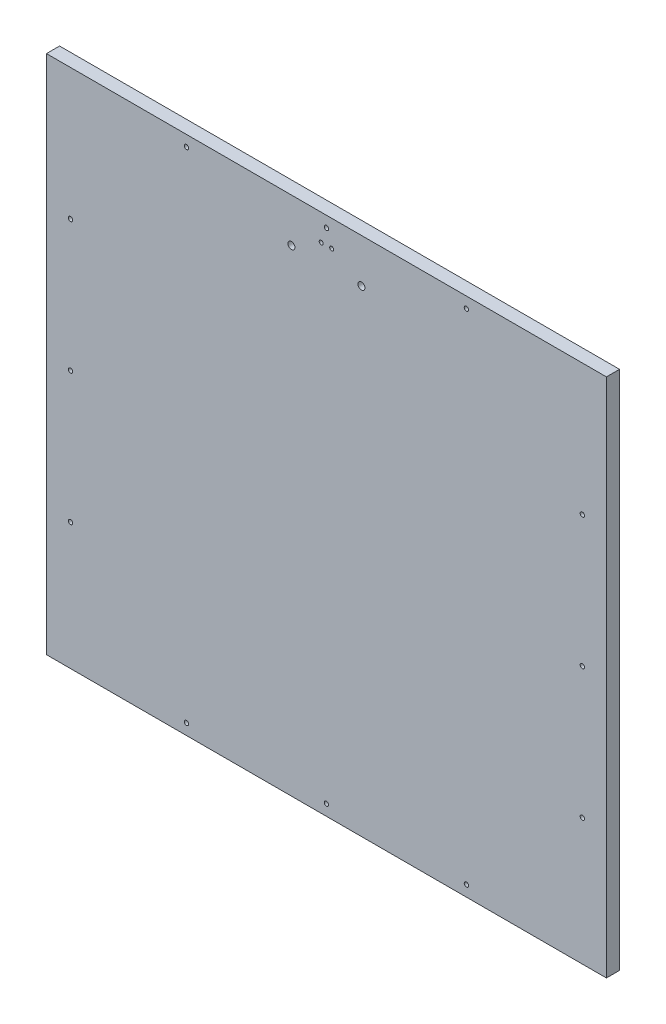
ISO-10303-21;
HEADER;
FILE_DESCRIPTION(('STEP AP214'),'2;1');
FILE_NAME('part.step','',(''),(''),'','','');
FILE_SCHEMA(('AUTOMOTIVE_DESIGN { 1 0 10303 214 1 1 1 1 }'));
ENDSEC;
DATA;
#1=APPLICATION_CONTEXT('core data for automotive mechanical design processes');
#2=APPLICATION_PROTOCOL_DEFINITION('international standard','automotive_design',2000,#1);
#3=PRODUCT_CONTEXT('',#1,'mechanical');
#4=PRODUCT('Part','Part','',(#3));
#5=PRODUCT_RELATED_PRODUCT_CATEGORY('part','',(#4));
#6=PRODUCT_DEFINITION_FORMATION('','',#4);
#7=PRODUCT_DEFINITION_CONTEXT('part definition',#1,'design');
#8=PRODUCT_DEFINITION('design','',#6,#7);
#9=PRODUCT_DEFINITION_SHAPE('','',#8);
#10=(LENGTH_UNIT() NAMED_UNIT(*) SI_UNIT(.MILLI.,.METRE.));
#11=(NAMED_UNIT(*) PLANE_ANGLE_UNIT() SI_UNIT($,.RADIAN.));
#12=(NAMED_UNIT(*) SI_UNIT($,.STERADIAN.) SOLID_ANGLE_UNIT());
#13=UNCERTAINTY_MEASURE_WITH_UNIT(LENGTH_MEASURE(1.E-05),#10,'distance_accuracy_value','');
#14=(GEOMETRIC_REPRESENTATION_CONTEXT(3) GLOBAL_UNCERTAINTY_ASSIGNED_CONTEXT((#13)) GLOBAL_UNIT_ASSIGNED_CONTEXT((#10,
#11,#12)) REPRESENTATION_CONTEXT('',''));
#15=CARTESIAN_POINT('',(0.,0.,0.));
#16=DIRECTION('',(0.,0.,1.));
#17=DIRECTION('',(1.,0.,0.));
#18=AXIS2_PLACEMENT_3D('',#15,#16,#17);
#19=CARTESIAN_POINT('',(320.,297.5,15.));
#20=DIRECTION('',(-1.,0.,0.));
#21=DIRECTION('',(0.,-1.,0.));
#22=AXIS2_PLACEMENT_3D('',#19,#20,#21);
#23=PLANE('',#22);
#24=DIRECTION('',(0.,1.,0.));
#25=VECTOR('',#24,1.);
#26=CARTESIAN_POINT('',(320.,297.5,0.));
#27=LINE('',#26,#25);
#28=CARTESIAN_POINT('',(320.,-297.5,0.));
#29=VERTEX_POINT('',#28);
#30=CARTESIAN_POINT('',(320.,297.5,0.));
#31=VERTEX_POINT('',#30);
#32=EDGE_CURVE('E102',#29,#31,#27,.T.);
#33=ORIENTED_EDGE('',*,*,#32,.T.);
#34=DIRECTION('',(0.,0.,-1.));
#35=VECTOR('',#34,1.);
#36=CARTESIAN_POINT('',(320.,297.5,15.));
#37=LINE('',#36,#35);
#38=CARTESIAN_POINT('',(320.,297.5,15.));
#39=VERTEX_POINT('',#38);
#40=EDGE_CURVE('E11',#39,#31,#37,.T.);
#41=ORIENTED_EDGE('',*,*,#40,.F.);
#42=DIRECTION('',(0.,1.,0.));
#43=VECTOR('',#42,1.);
#44=CARTESIAN_POINT('',(320.,297.5,15.));
#45=LINE('',#44,#43);
#46=CARTESIAN_POINT('',(320.,-297.5,15.));
#47=VERTEX_POINT('',#46);
#48=EDGE_CURVE('E90',#47,#39,#45,.T.);
#49=ORIENTED_EDGE('',*,*,#48,.F.);
#50=DIRECTION('',(0.,0.,-1.));
#51=VECTOR('',#50,1.);
#52=CARTESIAN_POINT('',(320.,-297.5,15.));
#53=LINE('',#52,#51);
#54=EDGE_CURVE('E98',#47,#29,#53,.T.);
#55=ORIENTED_EDGE('',*,*,#54,.T.);
#56=EDGE_LOOP('',(#33,#41,#49,#55));
#57=FACE_BOUND('',#56,.T.);
#58=ADVANCED_FACE('F39',(#57),#23,.F.);
#59=CARTESIAN_POINT('',(-320.,297.5,15.));
#60=DIRECTION('',(0.,-1.,0.));
#61=DIRECTION('',(0.,0.,-1.));
#62=AXIS2_PLACEMENT_3D('',#59,#60,#61);
#63=PLANE('',#62);
#64=DIRECTION('',(-1.,0.,0.));
#65=VECTOR('',#64,1.);
#66=CARTESIAN_POINT('',(-320.,297.5,0.));
#67=LINE('',#66,#65);
#68=CARTESIAN_POINT('',(-320.,297.5,0.));
#69=VERTEX_POINT('',#68);
#70=EDGE_CURVE('E94',#31,#69,#67,.T.);
#71=ORIENTED_EDGE('',*,*,#70,.T.);
#72=DIRECTION('',(0.,0.,-1.));
#73=VECTOR('',#72,1.);
#74=CARTESIAN_POINT('',(-320.,297.5,15.));
#75=LINE('',#74,#73);
#76=CARTESIAN_POINT('',(-320.,297.5,15.));
#77=VERTEX_POINT('',#76);
#78=EDGE_CURVE('E47',#77,#69,#75,.T.);
#79=ORIENTED_EDGE('',*,*,#78,.F.);
#80=DIRECTION('',(-1.,0.,0.));
#81=VECTOR('',#80,1.);
#82=CARTESIAN_POINT('',(-320.,297.5,15.));
#83=LINE('',#82,#81);
#84=EDGE_CURVE('E85',#39,#77,#83,.T.);
#85=ORIENTED_EDGE('',*,*,#84,.F.);
#86=ORIENTED_EDGE('',*,*,#40,.T.);
#87=EDGE_LOOP('',(#71,#79,#85,#86));
#88=FACE_BOUND('',#87,.T.);
#89=ADVANCED_FACE('F93',(#88),#63,.F.);
#90=CARTESIAN_POINT('',(-320.,297.5,15.));
#91=DIRECTION('',(1.,0.,0.));
#92=DIRECTION('',(0.,0.,-1.));
#93=AXIS2_PLACEMENT_3D('',#90,#91,#92);
#94=PLANE('',#93);
#95=DIRECTION('',(0.,-1.,0.));
#96=VECTOR('',#95,1.);
#97=CARTESIAN_POINT('',(-320.,297.5,0.));
#98=LINE('',#97,#96);
#99=CARTESIAN_POINT('',(-320.,-297.5,0.));
#100=VERTEX_POINT('',#99);
#101=EDGE_CURVE('E72',#69,#100,#98,.T.);
#102=ORIENTED_EDGE('',*,*,#101,.T.);
#103=DIRECTION('',(0.,0.,-1.));
#104=VECTOR('',#103,1.);
#105=CARTESIAN_POINT('',(-320.,-297.5,15.));
#106=LINE('',#105,#104);
#107=CARTESIAN_POINT('',(-320.,-297.5,15.));
#108=VERTEX_POINT('',#107);
#109=EDGE_CURVE('E95',#108,#100,#106,.T.);
#110=ORIENTED_EDGE('',*,*,#109,.F.);
#111=DIRECTION('',(0.,-1.,0.));
#112=VECTOR('',#111,1.);
#113=CARTESIAN_POINT('',(-320.,297.5,15.));
#114=LINE('',#113,#112);
#115=EDGE_CURVE('E88',#77,#108,#114,.T.);
#116=ORIENTED_EDGE('',*,*,#115,.F.);
#117=ORIENTED_EDGE('',*,*,#78,.T.);
#118=EDGE_LOOP('',(#102,#110,#116,#117));
#119=FACE_BOUND('',#118,.T.);
#120=ADVANCED_FACE('F96',(#119),#94,.F.);
#121=CARTESIAN_POINT('',(-320.,-297.5,15.));
#122=DIRECTION('',(0.,1.,0.));
#123=DIRECTION('',(0.,0.,1.));
#124=AXIS2_PLACEMENT_3D('',#121,#122,#123);
#125=PLANE('',#124);
#126=DIRECTION('',(1.,0.,0.));
#127=VECTOR('',#126,1.);
#128=CARTESIAN_POINT('',(-320.,-297.5,0.));
#129=LINE('',#128,#127);
#130=EDGE_CURVE('E78',#100,#29,#129,.T.);
#131=ORIENTED_EDGE('',*,*,#130,.T.);
#132=ORIENTED_EDGE('',*,*,#54,.F.);
#133=DIRECTION('',(1.,0.,0.));
#134=VECTOR('',#133,1.);
#135=CARTESIAN_POINT('',(-320.,-297.5,15.));
#136=LINE('',#135,#134);
#137=EDGE_CURVE('E55',#108,#47,#136,.T.);
#138=ORIENTED_EDGE('',*,*,#137,.F.);
#139=ORIENTED_EDGE('',*,*,#109,.T.);
#140=EDGE_LOOP('',(#131,#132,#138,#139));
#141=FACE_BOUND('',#140,.T.);
#142=ADVANCED_FACE('F110',(#141),#125,.F.);
#143=CARTESIAN_POINT('',(0.,0.,15.));
#144=DIRECTION('',(0.,0.,1.));
#145=DIRECTION('',(1.,0.,0.));
#146=AXIS2_PLACEMENT_3D('',#143,#144,#145);
#147=PLANE('',#146);
#148=CARTESIAN_POINT('',(-6.,267.5,15.));
#149=DIRECTION('',(0.,0.,-1.));
#150=DIRECTION('',(-1.,0.,0.));
#151=AXIS2_PLACEMENT_3D('',#148,#149,#150);
#152=CIRCLE('',#151,2.25);
#153=CARTESIAN_POINT('',(-8.25,267.5,15.));
#154=VERTEX_POINT('',#153);
#155=EDGE_CURVE('E206',#154,#154,#152,.T.);
#156=ORIENTED_EDGE('',*,*,#155,.T.);
#157=EDGE_LOOP('',(#156));
#158=FACE_BOUND('',#157,.T.);
#159=CARTESIAN_POINT('',(6.,267.5,15.));
#160=DIRECTION('',(0.,0.,1.));
#161=DIRECTION('',(1.,0.,0.));
#162=AXIS2_PLACEMENT_3D('',#159,#160,#161);
#163=CIRCLE('',#162,2.25);
#164=CARTESIAN_POINT('',(8.25,267.5,15.));
#165=VERTEX_POINT('',#164);
#166=EDGE_CURVE('E200',#165,#165,#163,.T.);
#167=ORIENTED_EDGE('',*,*,#166,.F.);
#168=EDGE_LOOP('',(#167));
#169=FACE_BOUND('',#168,.T.);
#170=CARTESIAN_POINT('',(40.0000000000001,247.5,15.));
#171=DIRECTION('',(0.,0.,-1.));
#172=DIRECTION('',(-1.,0.,0.));
#173=AXIS2_PLACEMENT_3D('',#170,#171,#172);
#174=CIRCLE('',#173,4.);
#175=CARTESIAN_POINT('',(36.0000000000001,247.5,15.));
#176=VERTEX_POINT('',#175);
#177=EDGE_CURVE('E174',#176,#176,#174,.T.);
#178=ORIENTED_EDGE('',*,*,#177,.T.);
#179=EDGE_LOOP('',(#178));
#180=FACE_BOUND('',#179,.T.);
#181=CARTESIAN_POINT('',(-39.9999999999999,247.5,15.));
#182=DIRECTION('',(0.,0.,-1.));
#183=DIRECTION('',(-1.,0.,0.));
#184=AXIS2_PLACEMENT_3D('',#181,#182,#183);
#185=CIRCLE('',#184,4.);
#186=CARTESIAN_POINT('',(-43.9999999999999,247.5,15.));
#187=VERTEX_POINT('',#186);
#188=EDGE_CURVE('E188',#187,#187,#185,.T.);
#189=ORIENTED_EDGE('',*,*,#188,.T.);
#190=EDGE_LOOP('',(#189));
#191=FACE_BOUND('',#190,.T.);
#192=CARTESIAN_POINT('',(292.5,147.5,15.));
#193=DIRECTION('',(0.,0.,-1.));
#194=DIRECTION('',(-1.,0.,0.));
#195=AXIS2_PLACEMENT_3D('',#192,#193,#194);
#196=CIRCLE('',#195,2.50000000000002);
#197=CARTESIAN_POINT('',(290.,147.5,15.));
#198=VERTEX_POINT('',#197);
#199=EDGE_CURVE('E183',#198,#198,#196,.T.);
#200=ORIENTED_EDGE('',*,*,#199,.T.);
#201=EDGE_LOOP('',(#200));
#202=FACE_BOUND('',#201,.T.);
#203=CARTESIAN_POINT('',(292.5,-2.50000000000006,15.));
#204=DIRECTION('',(0.,0.,-1.));
#205=DIRECTION('',(-1.,0.,0.));
#206=AXIS2_PLACEMENT_3D('',#203,#204,#205);
#207=CIRCLE('',#206,2.50000000000002);
#208=CARTESIAN_POINT('',(290.,-2.50000000000006,15.));
#209=VERTEX_POINT('',#208);
#210=EDGE_CURVE('E177',#209,#209,#207,.T.);
#211=ORIENTED_EDGE('',*,*,#210,.T.);
#212=EDGE_LOOP('',(#211));
#213=FACE_BOUND('',#212,.T.);
#214=CARTESIAN_POINT('',(292.5,-152.5,15.));
#215=DIRECTION('',(0.,0.,-1.));
#216=DIRECTION('',(-1.,0.,0.));
#217=AXIS2_PLACEMENT_3D('',#214,#215,#216);
#218=CIRCLE('',#217,2.50000000000002);
#219=CARTESIAN_POINT('',(290.,-152.5,15.));
#220=VERTEX_POINT('',#219);
#221=EDGE_CURVE('E170',#220,#220,#218,.T.);
#222=ORIENTED_EDGE('',*,*,#221,.T.);
#223=EDGE_LOOP('',(#222));
#224=FACE_BOUND('',#223,.T.);
#225=CARTESIAN_POINT('',(-160.,-285.,15.));
#226=DIRECTION('',(0.,0.,-1.));
#227=DIRECTION('',(1.,0.,0.));
#228=AXIS2_PLACEMENT_3D('',#225,#226,#227);
#229=CIRCLE('',#228,2.5);
#230=CARTESIAN_POINT('',(-157.5,-285.,15.));
#231=VERTEX_POINT('',#230);
#232=EDGE_CURVE('E165',#231,#231,#229,.T.);
#233=ORIENTED_EDGE('',*,*,#232,.T.);
#234=EDGE_LOOP('',(#233));
#235=FACE_BOUND('',#234,.T.);
#236=CARTESIAN_POINT('',(0.,-285.,15.));
#237=DIRECTION('',(0.,0.,-1.));
#238=DIRECTION('',(1.,0.,0.));
#239=AXIS2_PLACEMENT_3D('',#236,#237,#238);
#240=CIRCLE('',#239,2.5);
#241=CARTESIAN_POINT('',(2.5,-285.,15.));
#242=VERTEX_POINT('',#241);
#243=EDGE_CURVE('E159',#242,#242,#240,.T.);
#244=ORIENTED_EDGE('',*,*,#243,.T.);
#245=EDGE_LOOP('',(#244));
#246=FACE_BOUND('',#245,.T.);
#247=CARTESIAN_POINT('',(160.,-285.,15.));
#248=DIRECTION('',(0.,0.,-1.));
#249=DIRECTION('',(1.,0.,0.));
#250=AXIS2_PLACEMENT_3D('',#247,#248,#249);
#251=CIRCLE('',#250,2.5);
#252=CARTESIAN_POINT('',(162.5,-285.,15.));
#253=VERTEX_POINT('',#252);
#254=EDGE_CURVE('E152',#253,#253,#251,.T.);
#255=ORIENTED_EDGE('',*,*,#254,.T.);
#256=EDGE_LOOP('',(#255));
#257=FACE_BOUND('',#256,.T.);
#258=CARTESIAN_POINT('',(-292.5,147.5,15.));
#259=DIRECTION('',(0.,0.,1.));
#260=DIRECTION('',(1.,0.,0.));
#261=AXIS2_PLACEMENT_3D('',#258,#259,#260);
#262=CIRCLE('',#261,2.50000000000002);
#263=CARTESIAN_POINT('',(-290.,147.5,15.));
#264=VERTEX_POINT('',#263);
#265=EDGE_CURVE('E147',#264,#264,#262,.T.);
#266=ORIENTED_EDGE('',*,*,#265,.F.);
#267=EDGE_LOOP('',(#266));
#268=FACE_BOUND('',#267,.T.);
#269=CARTESIAN_POINT('',(-292.5,-2.50000000000006,15.));
#270=DIRECTION('',(0.,0.,1.));
#271=DIRECTION('',(1.,0.,0.));
#272=AXIS2_PLACEMENT_3D('',#269,#270,#271);
#273=CIRCLE('',#272,2.50000000000002);
#274=CARTESIAN_POINT('',(-290.,-2.50000000000006,15.));
#275=VERTEX_POINT('',#274);
#276=EDGE_CURVE('E144',#275,#275,#273,.T.);
#277=ORIENTED_EDGE('',*,*,#276,.F.);
#278=EDGE_LOOP('',(#277));
#279=FACE_BOUND('',#278,.T.);
#280=CARTESIAN_POINT('',(-292.5,-152.5,15.));
#281=DIRECTION('',(0.,0.,1.));
#282=DIRECTION('',(1.,0.,0.));
#283=AXIS2_PLACEMENT_3D('',#280,#281,#282);
#284=CIRCLE('',#283,2.50000000000002);
#285=CARTESIAN_POINT('',(-290.,-152.5,15.));
#286=VERTEX_POINT('',#285);
#287=EDGE_CURVE('E137',#286,#286,#284,.T.);
#288=ORIENTED_EDGE('',*,*,#287,.F.);
#289=EDGE_LOOP('',(#288));
#290=FACE_BOUND('',#289,.T.);
#291=CARTESIAN_POINT('',(-160.,285.,15.));
#292=DIRECTION('',(0.,0.,1.));
#293=DIRECTION('',(1.,0.,0.));
#294=AXIS2_PLACEMENT_3D('',#291,#292,#293);
#295=CIRCLE('',#294,2.5);
#296=CARTESIAN_POINT('',(-157.5,285.,15.));
#297=VERTEX_POINT('',#296);
#298=EDGE_CURVE('E129',#297,#297,#295,.T.);
#299=ORIENTED_EDGE('',*,*,#298,.F.);
#300=EDGE_LOOP('',(#299));
#301=FACE_BOUND('',#300,.T.);
#302=CARTESIAN_POINT('',(0.,285.,15.));
#303=DIRECTION('',(0.,0.,1.));
#304=DIRECTION('',(1.,0.,0.));
#305=AXIS2_PLACEMENT_3D('',#302,#303,#304);
#306=CIRCLE('',#305,2.5);
#307=CARTESIAN_POINT('',(2.5,285.,15.));
#308=VERTEX_POINT('',#307);
#309=EDGE_CURVE('E126',#308,#308,#306,.T.);
#310=ORIENTED_EDGE('',*,*,#309,.F.);
#311=EDGE_LOOP('',(#310));
#312=FACE_BOUND('',#311,.T.);
#313=CARTESIAN_POINT('',(160.,285.,15.));
#314=DIRECTION('',(0.,0.,1.));
#315=DIRECTION('',(1.,0.,0.));
#316=AXIS2_PLACEMENT_3D('',#313,#314,#315);
#317=CIRCLE('',#316,2.5);
#318=CARTESIAN_POINT('',(162.5,285.,15.));
#319=VERTEX_POINT('',#318);
#320=EDGE_CURVE('E119',#319,#319,#317,.T.);
#321=ORIENTED_EDGE('',*,*,#320,.F.);
#322=EDGE_LOOP('',(#321));
#323=FACE_BOUND('',#322,.T.);
#324=ORIENTED_EDGE('',*,*,#48,.T.);
#325=ORIENTED_EDGE('',*,*,#84,.T.);
#326=ORIENTED_EDGE('',*,*,#115,.T.);
#327=ORIENTED_EDGE('',*,*,#137,.T.);
#328=EDGE_LOOP('',(#324,#325,#326,#327));
#329=FACE_BOUND('',#328,.T.);
#330=ADVANCED_FACE('F86',(#158,#169,#180,#191,#202,#213,#224,#235,#246,#257,#268,#279,#290,#301,
#312,#323,#329),#147,.T.);
#331=CARTESIAN_POINT('',(0.,0.,0.));
#332=DIRECTION('',(0.,0.,1.));
#333=DIRECTION('',(1.,0.,0.));
#334=AXIS2_PLACEMENT_3D('',#331,#332,#333);
#335=PLANE('',#334);
#336=CARTESIAN_POINT('',(-6.,267.5,0.));
#337=DIRECTION('',(0.,0.,-1.));
#338=DIRECTION('',(-1.,0.,0.));
#339=AXIS2_PLACEMENT_3D('',#336,#337,#338);
#340=CIRCLE('',#339,2.25);
#341=CARTESIAN_POINT('',(-8.25,267.5,0.));
#342=VERTEX_POINT('',#341);
#343=EDGE_CURVE('E203',#342,#342,#340,.T.);
#344=ORIENTED_EDGE('',*,*,#343,.F.);
#345=EDGE_LOOP('',(#344));
#346=FACE_BOUND('',#345,.T.);
#347=CARTESIAN_POINT('',(6.,267.5,0.));
#348=DIRECTION('',(0.,0.,1.));
#349=DIRECTION('',(1.,0.,0.));
#350=AXIS2_PLACEMENT_3D('',#347,#348,#349);
#351=CIRCLE('',#350,2.25);
#352=CARTESIAN_POINT('',(8.25,267.5,0.));
#353=VERTEX_POINT('',#352);
#354=EDGE_CURVE('E192',#353,#353,#351,.T.);
#355=ORIENTED_EDGE('',*,*,#354,.T.);
#356=EDGE_LOOP('',(#355));
#357=FACE_BOUND('',#356,.T.);
#358=CARTESIAN_POINT('',(40.0000000000001,247.5,0.));
#359=DIRECTION('',(0.,0.,-1.));
#360=DIRECTION('',(-1.,0.,0.));
#361=AXIS2_PLACEMENT_3D('',#358,#359,#360);
#362=CIRCLE('',#361,4.);
#363=CARTESIAN_POINT('',(36.0000000000001,247.5,0.));
#364=VERTEX_POINT('',#363);
#365=EDGE_CURVE('E195',#364,#364,#362,.T.);
#366=ORIENTED_EDGE('',*,*,#365,.F.);
#367=EDGE_LOOP('',(#366));
#368=FACE_BOUND('',#367,.T.);
#369=CARTESIAN_POINT('',(-39.9999999999999,247.5,0.));
#370=DIRECTION('',(0.,0.,-1.));
#371=DIRECTION('',(-1.,0.,0.));
#372=AXIS2_PLACEMENT_3D('',#369,#370,#371);
#373=CIRCLE('',#372,4.);
#374=CARTESIAN_POINT('',(-43.9999999999999,247.5,0.));
#375=VERTEX_POINT('',#374);
#376=EDGE_CURVE('E191',#375,#375,#373,.T.);
#377=ORIENTED_EDGE('',*,*,#376,.F.);
#378=EDGE_LOOP('',(#377));
#379=FACE_BOUND('',#378,.T.);
#380=CARTESIAN_POINT('',(292.5,147.5,0.));
#381=DIRECTION('',(0.,0.,-1.));
#382=DIRECTION('',(-1.,0.,0.));
#383=AXIS2_PLACEMENT_3D('',#380,#381,#382);
#384=CIRCLE('',#383,2.50000000000002);
#385=CARTESIAN_POINT('',(290.,147.5,0.));
#386=VERTEX_POINT('',#385);
#387=EDGE_CURVE('E156',#386,#386,#384,.T.);
#388=ORIENTED_EDGE('',*,*,#387,.F.);
#389=EDGE_LOOP('',(#388));
#390=FACE_BOUND('',#389,.T.);
#391=CARTESIAN_POINT('',(292.5,-2.50000000000006,0.));
#392=DIRECTION('',(0.,0.,-1.));
#393=DIRECTION('',(-1.,0.,0.));
#394=AXIS2_PLACEMENT_3D('',#391,#392,#393);
#395=CIRCLE('',#394,2.50000000000002);
#396=CARTESIAN_POINT('',(290.,-2.50000000000006,0.));
#397=VERTEX_POINT('',#396);
#398=EDGE_CURVE('E180',#397,#397,#395,.T.);
#399=ORIENTED_EDGE('',*,*,#398,.F.);
#400=EDGE_LOOP('',(#399));
#401=FACE_BOUND('',#400,.T.);
#402=CARTESIAN_POINT('',(292.5,-152.5,0.));
#403=DIRECTION('',(0.,0.,-1.));
#404=DIRECTION('',(-1.,0.,0.));
#405=AXIS2_PLACEMENT_3D('',#402,#403,#404);
#406=CIRCLE('',#405,2.50000000000002);
#407=CARTESIAN_POINT('',(290.,-152.5,0.));
#408=VERTEX_POINT('',#407);
#409=EDGE_CURVE('E173',#408,#408,#406,.T.);
#410=ORIENTED_EDGE('',*,*,#409,.F.);
#411=EDGE_LOOP('',(#410));
#412=FACE_BOUND('',#411,.T.);
#413=CARTESIAN_POINT('',(-160.,-285.,0.));
#414=DIRECTION('',(0.,0.,-1.));
#415=DIRECTION('',(1.,0.,0.));
#416=AXIS2_PLACEMENT_3D('',#413,#414,#415);
#417=CIRCLE('',#416,2.5);
#418=CARTESIAN_POINT('',(-157.5,-285.,0.));
#419=VERTEX_POINT('',#418);
#420=EDGE_CURVE('E138',#419,#419,#417,.T.);
#421=ORIENTED_EDGE('',*,*,#420,.F.);
#422=EDGE_LOOP('',(#421));
#423=FACE_BOUND('',#422,.T.);
#424=CARTESIAN_POINT('',(0.,-285.,0.));
#425=DIRECTION('',(0.,0.,-1.));
#426=DIRECTION('',(1.,0.,0.));
#427=AXIS2_PLACEMENT_3D('',#424,#425,#426);
#428=CIRCLE('',#427,2.5);
#429=CARTESIAN_POINT('',(2.5,-285.,0.));
#430=VERTEX_POINT('',#429);
#431=EDGE_CURVE('E162',#430,#430,#428,.T.);
#432=ORIENTED_EDGE('',*,*,#431,.F.);
#433=EDGE_LOOP('',(#432));
#434=FACE_BOUND('',#433,.T.);
#435=CARTESIAN_POINT('',(160.,-285.,0.));
#436=DIRECTION('',(0.,0.,-1.));
#437=DIRECTION('',(1.,0.,0.));
#438=AXIS2_PLACEMENT_3D('',#435,#436,#437);
#439=CIRCLE('',#438,2.5);
#440=CARTESIAN_POINT('',(162.5,-285.,0.));
#441=VERTEX_POINT('',#440);
#442=EDGE_CURVE('E155',#441,#441,#439,.T.);
#443=ORIENTED_EDGE('',*,*,#442,.F.);
#444=EDGE_LOOP('',(#443));
#445=FACE_BOUND('',#444,.T.);
#446=CARTESIAN_POINT('',(-292.5,147.5,0.));
#447=DIRECTION('',(0.,0.,1.));
#448=DIRECTION('',(1.,0.,0.));
#449=AXIS2_PLACEMENT_3D('',#446,#447,#448);
#450=CIRCLE('',#449,2.50000000000002);
#451=CARTESIAN_POINT('',(-290.,147.5,0.));
#452=VERTEX_POINT('',#451);
#453=EDGE_CURVE('E120',#452,#452,#450,.T.);
#454=ORIENTED_EDGE('',*,*,#453,.T.);
#455=EDGE_LOOP('',(#454));
#456=FACE_BOUND('',#455,.T.);
#457=CARTESIAN_POINT('',(-292.5,-2.50000000000006,0.));
#458=DIRECTION('',(0.,0.,1.));
#459=DIRECTION('',(1.,0.,0.));
#460=AXIS2_PLACEMENT_3D('',#457,#458,#459);
#461=CIRCLE('',#460,2.50000000000002);
#462=CARTESIAN_POINT('',(-290.,-2.50000000000006,0.));
#463=VERTEX_POINT('',#462);
#464=EDGE_CURVE('E141',#463,#463,#461,.T.);
#465=ORIENTED_EDGE('',*,*,#464,.T.);
#466=EDGE_LOOP('',(#465));
#467=FACE_BOUND('',#466,.T.);
#468=CARTESIAN_POINT('',(-292.5,-152.5,0.));
#469=DIRECTION('',(0.,0.,1.));
#470=DIRECTION('',(1.,0.,0.));
#471=AXIS2_PLACEMENT_3D('',#468,#469,#470);
#472=CIRCLE('',#471,2.50000000000002);
#473=CARTESIAN_POINT('',(-290.,-152.5,0.));
#474=VERTEX_POINT('',#473);
#475=EDGE_CURVE('E134',#474,#474,#472,.T.);
#476=ORIENTED_EDGE('',*,*,#475,.T.);
#477=EDGE_LOOP('',(#476));
#478=FACE_BOUND('',#477,.T.);
#479=CARTESIAN_POINT('',(-160.,285.,0.));
#480=DIRECTION('',(0.,0.,1.));
#481=DIRECTION('',(1.,0.,0.));
#482=AXIS2_PLACEMENT_3D('',#479,#480,#481);
#483=CIRCLE('',#482,2.5);
#484=CARTESIAN_POINT('',(-157.5,285.,0.));
#485=VERTEX_POINT('',#484);
#486=EDGE_CURVE('E105',#485,#485,#483,.T.);
#487=ORIENTED_EDGE('',*,*,#486,.T.);
#488=EDGE_LOOP('',(#487));
#489=FACE_BOUND('',#488,.T.);
#490=CARTESIAN_POINT('',(0.,285.,0.));
#491=DIRECTION('',(0.,0.,1.));
#492=DIRECTION('',(1.,0.,0.));
#493=AXIS2_PLACEMENT_3D('',#490,#491,#492);
#494=CIRCLE('',#493,2.5);
#495=CARTESIAN_POINT('',(2.5,285.,0.));
#496=VERTEX_POINT('',#495);
#497=EDGE_CURVE('E123',#496,#496,#494,.T.);
#498=ORIENTED_EDGE('',*,*,#497,.T.);
#499=EDGE_LOOP('',(#498));
#500=FACE_BOUND('',#499,.T.);
#501=CARTESIAN_POINT('',(160.,285.,0.));
#502=DIRECTION('',(0.,0.,1.));
#503=DIRECTION('',(1.,0.,0.));
#504=AXIS2_PLACEMENT_3D('',#501,#502,#503);
#505=CIRCLE('',#504,2.5);
#506=CARTESIAN_POINT('',(162.5,285.,0.));
#507=VERTEX_POINT('',#506);
#508=EDGE_CURVE('E116',#507,#507,#505,.T.);
#509=ORIENTED_EDGE('',*,*,#508,.T.);
#510=EDGE_LOOP('',(#509));
#511=FACE_BOUND('',#510,.T.);
#512=ORIENTED_EDGE('',*,*,#32,.F.);
#513=ORIENTED_EDGE('',*,*,#130,.F.);
#514=ORIENTED_EDGE('',*,*,#101,.F.);
#515=ORIENTED_EDGE('',*,*,#70,.F.);
#516=EDGE_LOOP('',(#512,#513,#514,#515));
#517=FACE_BOUND('',#516,.T.);
#518=ADVANCED_FACE('F113',(#346,#357,#368,#379,#390,#401,#412,#423,#434,#445,#456,#467,#478,
#489,#500,#511,#517),#335,.F.);
#519=CARTESIAN_POINT('',(160.,285.,0.));
#520=DIRECTION('',(0.,0.,1.));
#521=DIRECTION('',(1.,0.,0.));
#522=AXIS2_PLACEMENT_3D('',#519,#520,#521);
#523=CYLINDRICAL_SURFACE('',#522,2.5);
#524=ORIENTED_EDGE('',*,*,#508,.F.);
#525=EDGE_LOOP('',(#524));
#526=FACE_BOUND('',#525,.T.);
#527=ORIENTED_EDGE('',*,*,#320,.T.);
#528=EDGE_LOOP('',(#527));
#529=FACE_BOUND('',#528,.T.);
#530=ADVANCED_FACE('F217',(#526,#529),#523,.F.);
#531=CARTESIAN_POINT('',(0.,285.,0.));
#532=DIRECTION('',(0.,0.,1.));
#533=DIRECTION('',(1.,0.,0.));
#534=AXIS2_PLACEMENT_3D('',#531,#532,#533);
#535=CYLINDRICAL_SURFACE('',#534,2.5);
#536=ORIENTED_EDGE('',*,*,#497,.F.);
#537=EDGE_LOOP('',(#536));
#538=FACE_BOUND('',#537,.T.);
#539=ORIENTED_EDGE('',*,*,#309,.T.);
#540=EDGE_LOOP('',(#539));
#541=FACE_BOUND('',#540,.T.);
#542=ADVANCED_FACE('F251',(#538,#541),#535,.F.);
#543=CARTESIAN_POINT('',(-160.,285.,0.));
#544=DIRECTION('',(0.,0.,1.));
#545=DIRECTION('',(1.,0.,0.));
#546=AXIS2_PLACEMENT_3D('',#543,#544,#545);
#547=CYLINDRICAL_SURFACE('',#546,2.5);
#548=ORIENTED_EDGE('',*,*,#486,.F.);
#549=EDGE_LOOP('',(#548));
#550=FACE_BOUND('',#549,.T.);
#551=ORIENTED_EDGE('',*,*,#298,.T.);
#552=EDGE_LOOP('',(#551));
#553=FACE_BOUND('',#552,.T.);
#554=ADVANCED_FACE('F301',(#550,#553),#547,.F.);
#555=CARTESIAN_POINT('',(-292.5,-152.5,0.));
#556=DIRECTION('',(0.,0.,1.));
#557=DIRECTION('',(1.,0.,0.));
#558=AXIS2_PLACEMENT_3D('',#555,#556,#557);
#559=CYLINDRICAL_SURFACE('',#558,2.50000000000002);
#560=ORIENTED_EDGE('',*,*,#475,.F.);
#561=EDGE_LOOP('',(#560));
#562=FACE_BOUND('',#561,.T.);
#563=ORIENTED_EDGE('',*,*,#287,.T.);
#564=EDGE_LOOP('',(#563));
#565=FACE_BOUND('',#564,.T.);
#566=ADVANCED_FACE('F309',(#562,#565),#559,.F.);
#567=CARTESIAN_POINT('',(-292.5,-2.50000000000006,0.));
#568=DIRECTION('',(0.,0.,1.));
#569=DIRECTION('',(1.,0.,0.));
#570=AXIS2_PLACEMENT_3D('',#567,#568,#569);
#571=CYLINDRICAL_SURFACE('',#570,2.50000000000002);
#572=ORIENTED_EDGE('',*,*,#464,.F.);
#573=EDGE_LOOP('',(#572));
#574=FACE_BOUND('',#573,.T.);
#575=ORIENTED_EDGE('',*,*,#276,.T.);
#576=EDGE_LOOP('',(#575));
#577=FACE_BOUND('',#576,.T.);
#578=ADVANCED_FACE('F317',(#574,#577),#571,.F.);
#579=CARTESIAN_POINT('',(-292.5,147.5,0.));
#580=DIRECTION('',(0.,0.,1.));
#581=DIRECTION('',(1.,0.,0.));
#582=AXIS2_PLACEMENT_3D('',#579,#580,#581);
#583=CYLINDRICAL_SURFACE('',#582,2.50000000000002);
#584=ORIENTED_EDGE('',*,*,#453,.F.);
#585=EDGE_LOOP('',(#584));
#586=FACE_BOUND('',#585,.T.);
#587=ORIENTED_EDGE('',*,*,#265,.T.);
#588=EDGE_LOOP('',(#587));
#589=FACE_BOUND('',#588,.T.);
#590=ADVANCED_FACE('F325',(#586,#589),#583,.F.);
#591=CARTESIAN_POINT('',(160.,-285.,0.));
#592=DIRECTION('',(0.,0.,1.));
#593=DIRECTION('',(1.,0.,0.));
#594=AXIS2_PLACEMENT_3D('',#591,#592,#593);
#595=CYLINDRICAL_SURFACE('',#594,2.5);
#596=ORIENTED_EDGE('',*,*,#442,.T.);
#597=EDGE_LOOP('',(#596));
#598=FACE_BOUND('',#597,.T.);
#599=ORIENTED_EDGE('',*,*,#254,.F.);
#600=EDGE_LOOP('',(#599));
#601=FACE_BOUND('',#600,.T.);
#602=ADVANCED_FACE('F333',(#598,#601),#595,.F.);
#603=CARTESIAN_POINT('',(0.,-285.,0.));
#604=DIRECTION('',(0.,0.,1.));
#605=DIRECTION('',(1.,0.,0.));
#606=AXIS2_PLACEMENT_3D('',#603,#604,#605);
#607=CYLINDRICAL_SURFACE('',#606,2.5);
#608=ORIENTED_EDGE('',*,*,#431,.T.);
#609=EDGE_LOOP('',(#608));
#610=FACE_BOUND('',#609,.T.);
#611=ORIENTED_EDGE('',*,*,#243,.F.);
#612=EDGE_LOOP('',(#611));
#613=FACE_BOUND('',#612,.T.);
#614=ADVANCED_FACE('F341',(#610,#613),#607,.F.);
#615=CARTESIAN_POINT('',(-160.,-285.,0.));
#616=DIRECTION('',(0.,0.,1.));
#617=DIRECTION('',(1.,0.,0.));
#618=AXIS2_PLACEMENT_3D('',#615,#616,#617);
#619=CYLINDRICAL_SURFACE('',#618,2.5);
#620=ORIENTED_EDGE('',*,*,#420,.T.);
#621=EDGE_LOOP('',(#620));
#622=FACE_BOUND('',#621,.T.);
#623=ORIENTED_EDGE('',*,*,#232,.F.);
#624=EDGE_LOOP('',(#623));
#625=FACE_BOUND('',#624,.T.);
#626=ADVANCED_FACE('F349',(#622,#625),#619,.F.);
#627=CARTESIAN_POINT('',(292.5,-152.5,0.));
#628=DIRECTION('',(0.,0.,1.));
#629=DIRECTION('',(1.,0.,0.));
#630=AXIS2_PLACEMENT_3D('',#627,#628,#629);
#631=CYLINDRICAL_SURFACE('',#630,2.50000000000002);
#632=ORIENTED_EDGE('',*,*,#409,.T.);
#633=EDGE_LOOP('',(#632));
#634=FACE_BOUND('',#633,.T.);
#635=ORIENTED_EDGE('',*,*,#221,.F.);
#636=EDGE_LOOP('',(#635));
#637=FACE_BOUND('',#636,.T.);
#638=ADVANCED_FACE('F357',(#634,#637),#631,.F.);
#639=CARTESIAN_POINT('',(292.5,-2.50000000000006,0.));
#640=DIRECTION('',(0.,0.,1.));
#641=DIRECTION('',(1.,0.,0.));
#642=AXIS2_PLACEMENT_3D('',#639,#640,#641);
#643=CYLINDRICAL_SURFACE('',#642,2.50000000000002);
#644=ORIENTED_EDGE('',*,*,#398,.T.);
#645=EDGE_LOOP('',(#644));
#646=FACE_BOUND('',#645,.T.);
#647=ORIENTED_EDGE('',*,*,#210,.F.);
#648=EDGE_LOOP('',(#647));
#649=FACE_BOUND('',#648,.T.);
#650=ADVANCED_FACE('F365',(#646,#649),#643,.F.);
#651=CARTESIAN_POINT('',(292.5,147.5,0.));
#652=DIRECTION('',(0.,0.,1.));
#653=DIRECTION('',(1.,0.,0.));
#654=AXIS2_PLACEMENT_3D('',#651,#652,#653);
#655=CYLINDRICAL_SURFACE('',#654,2.50000000000002);
#656=ORIENTED_EDGE('',*,*,#387,.T.);
#657=EDGE_LOOP('',(#656));
#658=FACE_BOUND('',#657,.T.);
#659=ORIENTED_EDGE('',*,*,#199,.F.);
#660=EDGE_LOOP('',(#659));
#661=FACE_BOUND('',#660,.T.);
#662=ADVANCED_FACE('F373',(#658,#661),#655,.F.);
#663=CARTESIAN_POINT('',(-39.9999999999999,247.5,15.));
#664=DIRECTION('',(0.,0.,-1.));
#665=DIRECTION('',(-1.,0.,0.));
#666=AXIS2_PLACEMENT_3D('',#663,#664,#665);
#667=CYLINDRICAL_SURFACE('',#666,4.);
#668=ORIENTED_EDGE('',*,*,#188,.F.);
#669=EDGE_LOOP('',(#668));
#670=FACE_BOUND('',#669,.T.);
#671=ORIENTED_EDGE('',*,*,#376,.T.);
#672=EDGE_LOOP('',(#671));
#673=FACE_BOUND('',#672,.T.);
#674=ADVANCED_FACE('F381',(#670,#673),#667,.F.);
#675=CARTESIAN_POINT('',(40.0000000000001,247.5,15.));
#676=DIRECTION('',(0.,0.,-1.));
#677=DIRECTION('',(-1.,0.,0.));
#678=AXIS2_PLACEMENT_3D('',#675,#676,#677);
#679=CYLINDRICAL_SURFACE('',#678,4.);
#680=ORIENTED_EDGE('',*,*,#177,.F.);
#681=EDGE_LOOP('',(#680));
#682=FACE_BOUND('',#681,.T.);
#683=ORIENTED_EDGE('',*,*,#365,.T.);
#684=EDGE_LOOP('',(#683));
#685=FACE_BOUND('',#684,.T.);
#686=ADVANCED_FACE('F389',(#682,#685),#679,.F.);
#687=CARTESIAN_POINT('',(6.,267.5,0.));
#688=DIRECTION('',(0.,0.,1.));
#689=DIRECTION('',(1.,0.,0.));
#690=AXIS2_PLACEMENT_3D('',#687,#688,#689);
#691=CYLINDRICAL_SURFACE('',#690,2.25);
#692=ORIENTED_EDGE('',*,*,#354,.F.);
#693=EDGE_LOOP('',(#692));
#694=FACE_BOUND('',#693,.T.);
#695=ORIENTED_EDGE('',*,*,#166,.T.);
#696=EDGE_LOOP('',(#695));
#697=FACE_BOUND('',#696,.T.);
#698=ADVANCED_FACE('F397',(#694,#697),#691,.F.);
#699=CARTESIAN_POINT('',(-6.,267.5,0.));
#700=DIRECTION('',(0.,0.,1.));
#701=DIRECTION('',(1.,0.,0.));
#702=AXIS2_PLACEMENT_3D('',#699,#700,#701);
#703=CYLINDRICAL_SURFACE('',#702,2.25);
#704=ORIENTED_EDGE('',*,*,#343,.T.);
#705=EDGE_LOOP('',(#704));
#706=FACE_BOUND('',#705,.T.);
#707=ORIENTED_EDGE('',*,*,#155,.F.);
#708=EDGE_LOOP('',(#707));
#709=FACE_BOUND('',#708,.T.);
#710=ADVANCED_FACE('F212',(#706,#709),#703,.F.);
#711=CLOSED_SHELL('',(#58,#89,#120,#142,#330,#518,#530,#542,#554,#566,#578,#590,#602,#614,#626,
#638,#650,#662,#674,#686,#698,#710));
#712=MANIFOLD_SOLID_BREP('B2',#711);
#713=ADVANCED_BREP_SHAPE_REPRESENTATION('',(#18,#712),#14);
#714=SHAPE_DEFINITION_REPRESENTATION(#9,#713);
ENDSEC;
END-ISO-10303-21;
